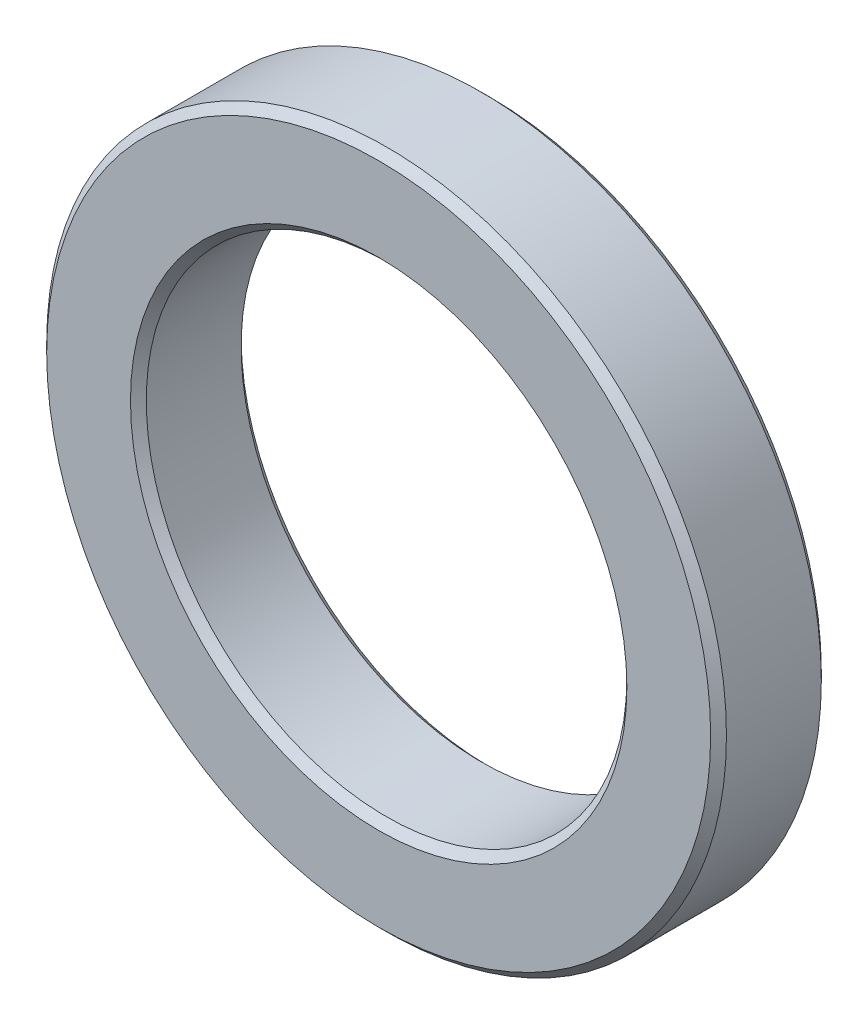
ISO-10303-21;
HEADER;
FILE_DESCRIPTION(('STEP AP214'),'2;1');
FILE_NAME('part.step','',(''),(''),'','','');
FILE_SCHEMA(('AUTOMOTIVE_DESIGN { 1 0 10303 214 1 1 1 1 }'));
ENDSEC;
DATA;
#1=APPLICATION_CONTEXT('core data for automotive mechanical design processes');
#2=APPLICATION_PROTOCOL_DEFINITION('international standard','automotive_design',2000,#1);
#3=PRODUCT_CONTEXT('',#1,'mechanical');
#4=PRODUCT('Part','Part','',(#3));
#5=PRODUCT_RELATED_PRODUCT_CATEGORY('part','',(#4));
#6=PRODUCT_DEFINITION_FORMATION('','',#4);
#7=PRODUCT_DEFINITION_CONTEXT('part definition',#1,'design');
#8=PRODUCT_DEFINITION('design','',#6,#7);
#9=PRODUCT_DEFINITION_SHAPE('','',#8);
#10=(LENGTH_UNIT() NAMED_UNIT(*) SI_UNIT(.MILLI.,.METRE.));
#11=(NAMED_UNIT(*) PLANE_ANGLE_UNIT() SI_UNIT($,.RADIAN.));
#12=(NAMED_UNIT(*) SI_UNIT($,.STERADIAN.) SOLID_ANGLE_UNIT());
#13=UNCERTAINTY_MEASURE_WITH_UNIT(LENGTH_MEASURE(1.E-05),#10,'distance_accuracy_value','');
#14=(GEOMETRIC_REPRESENTATION_CONTEXT(3) GLOBAL_UNCERTAINTY_ASSIGNED_CONTEXT((#13)) GLOBAL_UNIT_ASSIGNED_CONTEXT((#10,
#11,#12)) REPRESENTATION_CONTEXT('',''));
#15=CARTESIAN_POINT('',(0.,0.,0.));
#16=DIRECTION('',(0.,0.,1.));
#17=DIRECTION('',(1.,0.,0.));
#18=AXIS2_PLACEMENT_3D('',#15,#16,#17);
#19=CARTESIAN_POINT('',(0.,0.,3.5));
#20=DIRECTION('',(0.,0.,1.));
#21=DIRECTION('',(1.,0.,0.));
#22=AXIS2_PLACEMENT_3D('',#19,#20,#21);
#23=PLANE('',#22);
#24=CARTESIAN_POINT('',(0.,0.,3.5));
#25=DIRECTION('',(0.,0.,1.));
#26=DIRECTION('',(1.,0.,0.));
#27=AXIS2_PLACEMENT_3D('',#24,#25,#26);
#28=CIRCLE('',#27,15.7);
#29=CARTESIAN_POINT('',(15.7,0.,3.5));
#30=VERTEX_POINT('',#29);
#31=EDGE_CURVE('E46',#30,#30,#28,.F.);
#32=ORIENTED_EDGE('',*,*,#31,.T.);
#33=EDGE_LOOP('',(#32));
#34=FACE_BOUND('',#33,.T.);
#35=CARTESIAN_POINT('',(0.,0.,3.5));
#36=DIRECTION('',(0.,0.,1.));
#37=DIRECTION('',(1.,0.,0.));
#38=AXIS2_PLACEMENT_3D('',#35,#36,#37);
#39=CIRCLE('',#38,21.);
#40=CARTESIAN_POINT('',(21.,0.,3.5));
#41=VERTEX_POINT('',#40);
#42=EDGE_CURVE('E50',#41,#41,#39,.T.);
#43=ORIENTED_EDGE('',*,*,#42,.T.);
#44=EDGE_LOOP('',(#43));
#45=FACE_BOUND('',#44,.T.);
#46=ADVANCED_FACE('F35',(#34,#45),#23,.T.);
#47=CARTESIAN_POINT('',(0.,0.,-3.5));
#48=DIRECTION('',(0.,0.,1.));
#49=DIRECTION('',(1.,0.,0.));
#50=AXIS2_PLACEMENT_3D('',#47,#48,#49);
#51=PLANE('',#50);
#52=CARTESIAN_POINT('',(0.,0.,-3.5));
#53=DIRECTION('',(0.,0.,1.));
#54=DIRECTION('',(1.,0.,0.));
#55=AXIS2_PLACEMENT_3D('',#52,#53,#54);
#56=CIRCLE('',#55,15.7);
#57=CARTESIAN_POINT('',(15.7,0.,-3.5));
#58=VERTEX_POINT('',#57);
#59=EDGE_CURVE('E61',#58,#58,#56,.T.);
#60=ORIENTED_EDGE('',*,*,#59,.T.);
#61=EDGE_LOOP('',(#60));
#62=FACE_BOUND('',#61,.T.);
#63=CARTESIAN_POINT('',(0.,0.,-3.5));
#64=DIRECTION('',(0.,0.,1.));
#65=DIRECTION('',(1.,0.,0.));
#66=AXIS2_PLACEMENT_3D('',#63,#64,#65);
#67=CIRCLE('',#66,21.);
#68=CARTESIAN_POINT('',(21.,0.,-3.5));
#69=VERTEX_POINT('',#68);
#70=EDGE_CURVE('E64',#69,#69,#67,.F.);
#71=ORIENTED_EDGE('',*,*,#70,.T.);
#72=EDGE_LOOP('',(#71));
#73=FACE_BOUND('',#72,.T.);
#74=ADVANCED_FACE('F68',(#62,#73),#51,.F.);
#75=CARTESIAN_POINT('',(0.,0.,3.5));
#76=DIRECTION('',(0.,0.,-1.));
#77=DIRECTION('',(-1.,0.,0.));
#78=AXIS2_PLACEMENT_3D('',#75,#76,#77);
#79=CYLINDRICAL_SURFACE('',#78,21.5);
#80=CARTESIAN_POINT('',(0.,0.,-2.99999999999999));
#81=DIRECTION('',(0.,0.,1.));
#82=DIRECTION('',(1.,0.,0.));
#83=AXIS2_PLACEMENT_3D('',#80,#81,#82);
#84=CIRCLE('',#83,21.5);
#85=CARTESIAN_POINT('',(21.5,0.,-2.99999999999999));
#86=VERTEX_POINT('',#85);
#87=EDGE_CURVE('E10',#86,#86,#84,.T.);
#88=ORIENTED_EDGE('',*,*,#87,.T.);
#89=EDGE_LOOP('',(#88));
#90=FACE_BOUND('',#89,.T.);
#91=CARTESIAN_POINT('',(0.,0.,2.99999999999999));
#92=DIRECTION('',(0.,0.,1.));
#93=DIRECTION('',(1.,0.,0.));
#94=AXIS2_PLACEMENT_3D('',#91,#92,#93);
#95=CIRCLE('',#94,21.5);
#96=CARTESIAN_POINT('',(21.5,0.,2.99999999999999));
#97=VERTEX_POINT('',#96);
#98=EDGE_CURVE('E42',#97,#97,#95,.F.);
#99=ORIENTED_EDGE('',*,*,#98,.T.);
#100=EDGE_LOOP('',(#99));
#101=FACE_BOUND('',#100,.T.);
#102=ADVANCED_FACE('F88',(#90,#101),#79,.T.);
#103=CARTESIAN_POINT('',(0.,0.,3.5));
#104=DIRECTION('',(0.,0.,-1.));
#105=DIRECTION('',(-1.,0.,0.));
#106=AXIS2_PLACEMENT_3D('',#103,#104,#105);
#107=CYLINDRICAL_SURFACE('',#106,15.2);
#108=CARTESIAN_POINT('',(0.,0.,-3.00000000000001));
#109=DIRECTION('',(0.,0.,1.));
#110=DIRECTION('',(1.,0.,0.));
#111=AXIS2_PLACEMENT_3D('',#108,#109,#110);
#112=CIRCLE('',#111,15.2);
#113=CARTESIAN_POINT('',(15.2,0.,-3.00000000000001));
#114=VERTEX_POINT('',#113);
#115=EDGE_CURVE('E55',#114,#114,#112,.F.);
#116=ORIENTED_EDGE('',*,*,#115,.T.);
#117=EDGE_LOOP('',(#116));
#118=FACE_BOUND('',#117,.T.);
#119=CARTESIAN_POINT('',(0.,0.,3.));
#120=DIRECTION('',(0.,0.,1.));
#121=DIRECTION('',(1.,0.,0.));
#122=AXIS2_PLACEMENT_3D('',#119,#120,#121);
#123=CIRCLE('',#122,15.2);
#124=CARTESIAN_POINT('',(15.2,0.,3.));
#125=VERTEX_POINT('',#124);
#126=EDGE_CURVE('E58',#125,#125,#123,.T.);
#127=ORIENTED_EDGE('',*,*,#126,.T.);
#128=EDGE_LOOP('',(#127));
#129=FACE_BOUND('',#128,.T.);
#130=ADVANCED_FACE('F93',(#118,#129),#107,.F.);
#131=CARTESIAN_POINT('',(0.,0.,-3.5));
#132=DIRECTION('',(0.,0.,-1.));
#133=DIRECTION('',(-1.,0.,0.));
#134=AXIS2_PLACEMENT_3D('',#131,#132,#133);
#135=CONICAL_SURFACE('',#134,15.7,0.785398163397448);
#136=ORIENTED_EDGE('',*,*,#115,.F.);
#137=EDGE_LOOP('',(#136));
#138=FACE_BOUND('',#137,.T.);
#139=ORIENTED_EDGE('',*,*,#59,.F.);
#140=EDGE_LOOP('',(#139));
#141=FACE_BOUND('',#140,.T.);
#142=ADVANCED_FACE('F79',(#138,#141),#135,.F.);
#143=CARTESIAN_POINT('',(0.,0.,3.));
#144=DIRECTION('',(0.,0.,1.));
#145=DIRECTION('',(1.,0.,0.));
#146=AXIS2_PLACEMENT_3D('',#143,#144,#145);
#147=CONICAL_SURFACE('',#146,15.2,0.785398163397448);
#148=ORIENTED_EDGE('',*,*,#31,.F.);
#149=EDGE_LOOP('',(#148));
#150=FACE_BOUND('',#149,.T.);
#151=ORIENTED_EDGE('',*,*,#126,.F.);
#152=EDGE_LOOP('',(#151));
#153=FACE_BOUND('',#152,.T.);
#154=ADVANCED_FACE('F73',(#150,#153),#147,.F.);
#155=CARTESIAN_POINT('',(0.,0.,-2.99999999999999));
#156=DIRECTION('',(0.,0.,1.));
#157=DIRECTION('',(1.,0.,0.));
#158=AXIS2_PLACEMENT_3D('',#155,#156,#157);
#159=CONICAL_SURFACE('',#158,21.5,0.785398163397445);
#160=ORIENTED_EDGE('',*,*,#70,.F.);
#161=EDGE_LOOP('',(#160));
#162=FACE_BOUND('',#161,.T.);
#163=ORIENTED_EDGE('',*,*,#87,.F.);
#164=EDGE_LOOP('',(#163));
#165=FACE_BOUND('',#164,.T.);
#166=ADVANCED_FACE('F70',(#162,#165),#159,.T.);
#167=CARTESIAN_POINT('',(0.,0.,3.5));
#168=DIRECTION('',(0.,0.,-1.));
#169=DIRECTION('',(-1.,0.,0.));
#170=AXIS2_PLACEMENT_3D('',#167,#168,#169);
#171=CONICAL_SURFACE('',#170,21.,0.785398163397441);
#172=ORIENTED_EDGE('',*,*,#98,.F.);
#173=EDGE_LOOP('',(#172));
#174=FACE_BOUND('',#173,.T.);
#175=ORIENTED_EDGE('',*,*,#42,.F.);
#176=EDGE_LOOP('',(#175));
#177=FACE_BOUND('',#176,.T.);
#178=ADVANCED_FACE('F37',(#174,#177),#171,.T.);
#179=CLOSED_SHELL('',(#46,#74,#102,#130,#142,#154,#166,#178));
#180=MANIFOLD_SOLID_BREP('B2',#179);
#181=ADVANCED_BREP_SHAPE_REPRESENTATION('',(#18,#180),#14);
#182=SHAPE_DEFINITION_REPRESENTATION(#9,#181);
ENDSEC;
END-ISO-10303-21;
